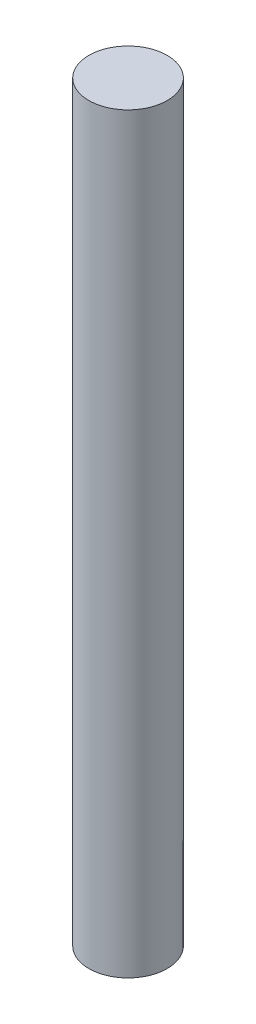
ISO-10303-21;
HEADER;
FILE_DESCRIPTION(('STEP AP214'),'2;1');
FILE_NAME('part.step','',(''),(''),'','','');
FILE_SCHEMA(('AUTOMOTIVE_DESIGN { 1 0 10303 214 1 1 1 1 }'));
ENDSEC;
DATA;
#1=APPLICATION_CONTEXT('core data for automotive mechanical design processes');
#2=APPLICATION_PROTOCOL_DEFINITION('international standard','automotive_design',2000,#1);
#3=PRODUCT_CONTEXT('',#1,'mechanical');
#4=PRODUCT('Part','Part','',(#3));
#5=PRODUCT_RELATED_PRODUCT_CATEGORY('part','',(#4));
#6=PRODUCT_DEFINITION_FORMATION('','',#4);
#7=PRODUCT_DEFINITION_CONTEXT('part definition',#1,'design');
#8=PRODUCT_DEFINITION('design','',#6,#7);
#9=PRODUCT_DEFINITION_SHAPE('','',#8);
#10=(LENGTH_UNIT() NAMED_UNIT(*) SI_UNIT(.MILLI.,.METRE.));
#11=(NAMED_UNIT(*) PLANE_ANGLE_UNIT() SI_UNIT($,.RADIAN.));
#12=(NAMED_UNIT(*) SI_UNIT($,.STERADIAN.) SOLID_ANGLE_UNIT());
#13=UNCERTAINTY_MEASURE_WITH_UNIT(LENGTH_MEASURE(1.E-05),#10,'distance_accuracy_value','');
#14=(GEOMETRIC_REPRESENTATION_CONTEXT(3) GLOBAL_UNCERTAINTY_ASSIGNED_CONTEXT((#13)) GLOBAL_UNIT_ASSIGNED_CONTEXT((#10,
#11,#12)) REPRESENTATION_CONTEXT('',''));
#15=CARTESIAN_POINT('',(0.,0.,0.));
#16=DIRECTION('',(0.,0.,1.));
#17=DIRECTION('',(1.,0.,0.));
#18=AXIS2_PLACEMENT_3D('',#15,#16,#17);
#19=CARTESIAN_POINT('',(0.,30.48,0.));
#20=DIRECTION('',(0.,-1.,0.));
#21=DIRECTION('',(0.,0.,-1.));
#22=AXIS2_PLACEMENT_3D('',#19,#20,#21);
#23=CYLINDRICAL_SURFACE('',#22,1.5875);
#24=CARTESIAN_POINT('',(0.,30.48,0.));
#25=DIRECTION('',(0.,1.,0.));
#26=DIRECTION('',(0.,0.,1.));
#27=AXIS2_PLACEMENT_3D('',#24,#25,#26);
#28=CIRCLE('',#27,1.5875);
#29=CARTESIAN_POINT('',(0.,30.48,-1.5875));
#30=VERTEX_POINT('',#29);
#31=EDGE_CURVE('E10',#30,#30,#28,.T.);
#32=CARTESIAN_POINT('',(0.,0.,0.));
#33=DIRECTION('',(0.,1.,0.));
#34=DIRECTION('',(0.,0.,1.));
#35=AXIS2_PLACEMENT_3D('',#32,#33,#34);
#36=CIRCLE('',#35,1.5875);
#37=CARTESIAN_POINT('',(0.,0.,-1.5875));
#38=VERTEX_POINT('',#37);
#39=EDGE_CURVE('E40',#38,#38,#36,.T.);
#40=CARTESIAN_POINT('',(0.,30.48,-1.5875));
#41=CARTESIAN_POINT('',(0.,30.1625,-1.5875));
#42=CARTESIAN_POINT('',(0.,29.845,-1.5875));
#43=CARTESIAN_POINT('',(0.,29.21,-1.5875));
#44=CARTESIAN_POINT('',(0.,28.8925,-1.5875));
#45=CARTESIAN_POINT('',(0.,28.2575,-1.5875));
#46=CARTESIAN_POINT('',(0.,27.94,-1.5875));
#47=CARTESIAN_POINT('',(0.,27.305,-1.5875));
#48=CARTESIAN_POINT('',(0.,26.9875,-1.5875));
#49=CARTESIAN_POINT('',(0.,26.3525,-1.5875));
#50=CARTESIAN_POINT('',(0.,26.035,-1.5875));
#51=CARTESIAN_POINT('',(0.,25.4,-1.5875));
#52=CARTESIAN_POINT('',(0.,25.0825,-1.5875));
#53=CARTESIAN_POINT('',(0.,24.4475,-1.5875));
#54=CARTESIAN_POINT('',(0.,24.13,-1.5875));
#55=CARTESIAN_POINT('',(0.,23.495,-1.5875));
#56=CARTESIAN_POINT('',(0.,23.1775,-1.5875));
#57=CARTESIAN_POINT('',(0.,22.5425,-1.5875));
#58=CARTESIAN_POINT('',(0.,22.225,-1.5875));
#59=CARTESIAN_POINT('',(0.,21.59,-1.5875));
#60=CARTESIAN_POINT('',(0.,21.2725,-1.5875));
#61=CARTESIAN_POINT('',(0.,20.6375,-1.5875));
#62=CARTESIAN_POINT('',(0.,20.32,-1.5875));
#63=CARTESIAN_POINT('',(0.,19.685,-1.5875));
#64=CARTESIAN_POINT('',(0.,19.3675,-1.5875));
#65=CARTESIAN_POINT('',(0.,18.7325,-1.5875));
#66=CARTESIAN_POINT('',(0.,18.415,-1.5875));
#67=CARTESIAN_POINT('',(0.,17.78,-1.5875));
#68=CARTESIAN_POINT('',(0.,17.4625,-1.5875));
#69=CARTESIAN_POINT('',(0.,16.8275,-1.5875));
#70=CARTESIAN_POINT('',(0.,16.51,-1.5875));
#71=CARTESIAN_POINT('',(0.,15.875,-1.5875));
#72=CARTESIAN_POINT('',(0.,15.5575,-1.5875));
#73=CARTESIAN_POINT('',(0.,14.9225,-1.5875));
#74=CARTESIAN_POINT('',(0.,14.605,-1.5875));
#75=CARTESIAN_POINT('',(0.,13.97,-1.5875));
#76=CARTESIAN_POINT('',(0.,13.6525,-1.5875));
#77=CARTESIAN_POINT('',(0.,13.0175,-1.5875));
#78=CARTESIAN_POINT('',(0.,12.7,-1.5875));
#79=CARTESIAN_POINT('',(0.,12.065,-1.5875));
#80=CARTESIAN_POINT('',(0.,11.7475,-1.5875));
#81=CARTESIAN_POINT('',(0.,11.1125,-1.5875));
#82=CARTESIAN_POINT('',(0.,10.795,-1.5875));
#83=CARTESIAN_POINT('',(0.,10.16,-1.5875));
#84=CARTESIAN_POINT('',(0.,9.8425,-1.5875));
#85=CARTESIAN_POINT('',(0.,9.2075,-1.5875));
#86=CARTESIAN_POINT('',(0.,8.89,-1.5875));
#87=CARTESIAN_POINT('',(0.,8.255,-1.5875));
#88=CARTESIAN_POINT('',(0.,7.9375,-1.5875));
#89=CARTESIAN_POINT('',(0.,7.3025,-1.5875));
#90=CARTESIAN_POINT('',(0.,6.985,-1.5875));
#91=CARTESIAN_POINT('',(0.,6.35,-1.5875));
#92=CARTESIAN_POINT('',(0.,6.0325,-1.5875));
#93=CARTESIAN_POINT('',(0.,5.3975,-1.5875));
#94=CARTESIAN_POINT('',(0.,5.08,-1.5875));
#95=CARTESIAN_POINT('',(0.,4.445,-1.5875));
#96=CARTESIAN_POINT('',(0.,4.1275,-1.5875));
#97=CARTESIAN_POINT('',(0.,3.4925,-1.5875));
#98=CARTESIAN_POINT('',(0.,3.175,-1.5875));
#99=CARTESIAN_POINT('',(0.,2.54,-1.5875));
#100=CARTESIAN_POINT('',(0.,2.2225,-1.5875));
#101=CARTESIAN_POINT('',(0.,1.5875,-1.5875));
#102=CARTESIAN_POINT('',(0.,1.27,-1.5875));
#103=CARTESIAN_POINT('',(0.,0.634999999999999,-1.5875));
#104=CARTESIAN_POINT('',(0.,0.3175,-1.5875));
#105=CARTESIAN_POINT('',(0.,0.,-1.5875));
#106=B_SPLINE_CURVE_WITH_KNOTS('',3,(#40,#41,#42,#43,#44,#45,#46,#47,#48,#49,#50,#51,#52,#53,
#54,#55,#56,#57,#58,#59,#60,#61,#62,#63,#64,#65,#66,#67,#68,#69,#70,#71,#72,#73,#74,#75,#76,#77,
#78,#79,#80,#81,#82,#83,#84,#85,#86,#87,#88,#89,#90,#91,#92,#93,#94,#95,#96,#97,#98,#99,#100,
#101,#102,#103,#104,#105),.UNSPECIFIED.,.F.,.F.,(4,2,2,2,2,2,2,2,2,2,2,2,2,2,2,2,2,2,2,2,2,2,2,
2,2,2,2,2,2,2,2,2,4),(0.,0.952500000000002,1.905,2.8575,3.81,4.7625,5.715,6.6675,7.62,8.5725,
9.525,10.4775,11.43,12.3825,13.335,14.2875,15.24,16.1925,17.145,18.0975,19.05,20.0025,20.955,
21.9075,22.86,23.8125,24.765,25.7175,26.67,27.6225,28.575,29.5275,30.48),.UNSPECIFIED.);
#107=EDGE_CURVE('BSEAM37',#30,#38,#106,.T.);
#108=ORIENTED_EDGE('',*,*,#31,.F.);
#109=ORIENTED_EDGE('',*,*,#39,.T.);
#110=ORIENTED_EDGE('',*,*,#107,.T.);
#111=ORIENTED_EDGE('',*,*,#107,.F.);
#112=EDGE_LOOP('',(#108,#110,#109,#111));
#113=FACE_BOUND('',#112,.T.);
#114=ADVANCED_FACE('F37',(#113),#23,.T.);
#115=CARTESIAN_POINT('',(0.,30.48,0.));
#116=DIRECTION('',(0.,1.,0.));
#117=DIRECTION('',(0.,0.,1.));
#118=AXIS2_PLACEMENT_3D('',#115,#116,#117);
#119=PLANE('',#118);
#120=ORIENTED_EDGE('',*,*,#31,.T.);
#121=EDGE_LOOP('',(#120));
#122=FACE_BOUND('',#121,.T.);
#123=ADVANCED_FACE('F52',(#122),#119,.T.);
#124=CARTESIAN_POINT('',(0.,0.,0.));
#125=DIRECTION('',(0.,1.,0.));
#126=DIRECTION('',(0.,0.,1.));
#127=AXIS2_PLACEMENT_3D('',#124,#125,#126);
#128=PLANE('',#127);
#129=ORIENTED_EDGE('',*,*,#39,.F.);
#130=EDGE_LOOP('',(#129));
#131=FACE_BOUND('',#130,.T.);
#132=ADVANCED_FACE('F50',(#131),#128,.F.);
#133=CLOSED_SHELL('',(#114,#123,#132));
#134=MANIFOLD_SOLID_BREP('B2',#133);
#135=ADVANCED_BREP_SHAPE_REPRESENTATION('',(#18,#134),#14);
#136=SHAPE_DEFINITION_REPRESENTATION(#9,#135);
ENDSEC;
END-ISO-10303-21;
